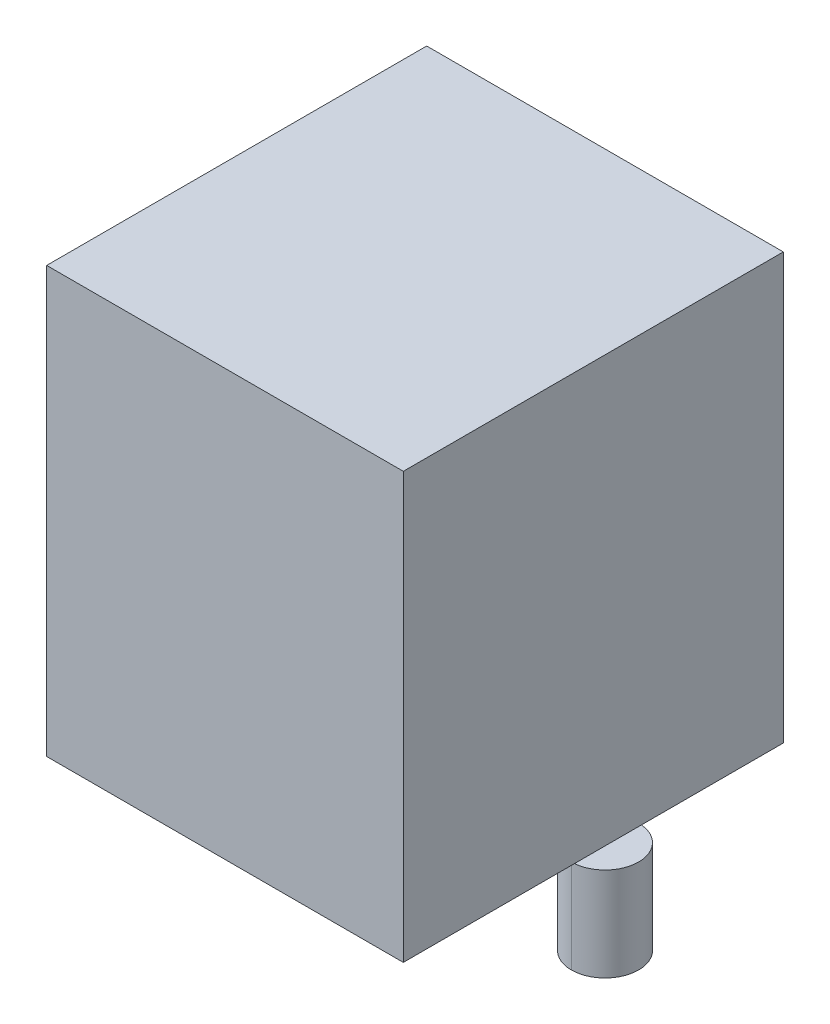
ISO-10303-21;
HEADER;
FILE_DESCRIPTION(('STEP AP214'),'2;1');
FILE_NAME('part.step','',(''),(''),'','','');
FILE_SCHEMA(('AUTOMOTIVE_DESIGN { 1 0 10303 214 1 1 1 1 }'));
ENDSEC;
DATA;
#1=APPLICATION_CONTEXT('core data for automotive mechanical design processes');
#2=APPLICATION_PROTOCOL_DEFINITION('international standard','automotive_design',2000,#1);
#3=PRODUCT_CONTEXT('',#1,'mechanical');
#4=PRODUCT('Part','Part','',(#3));
#5=PRODUCT_RELATED_PRODUCT_CATEGORY('part','',(#4));
#6=PRODUCT_DEFINITION_FORMATION('','',#4);
#7=PRODUCT_DEFINITION_CONTEXT('part definition',#1,'design');
#8=PRODUCT_DEFINITION('design','',#6,#7);
#9=PRODUCT_DEFINITION_SHAPE('','',#8);
#10=(LENGTH_UNIT() NAMED_UNIT(*) SI_UNIT(.MILLI.,.METRE.));
#11=(NAMED_UNIT(*) PLANE_ANGLE_UNIT() SI_UNIT($,.RADIAN.));
#12=(NAMED_UNIT(*) SI_UNIT($,.STERADIAN.) SOLID_ANGLE_UNIT());
#13=UNCERTAINTY_MEASURE_WITH_UNIT(LENGTH_MEASURE(1.E-05),#10,'distance_accuracy_value','');
#14=(GEOMETRIC_REPRESENTATION_CONTEXT(3) GLOBAL_UNCERTAINTY_ASSIGNED_CONTEXT((#13)) GLOBAL_UNIT_ASSIGNED_CONTEXT((#10,
#11,#12)) REPRESENTATION_CONTEXT('',''));
#15=CARTESIAN_POINT('',(0.,0.,0.));
#16=DIRECTION('',(0.,0.,1.));
#17=DIRECTION('',(1.,0.,0.));
#18=AXIS2_PLACEMENT_3D('',#15,#16,#17);
#19=CARTESIAN_POINT('',(0.,0.,-4.));
#20=DIRECTION('',(0.,0.,-1.));
#21=DIRECTION('',(0.,-1.,0.));
#22=AXIS2_PLACEMENT_3D('',#19,#20,#21);
#23=PLANE('',#22);
#24=DIRECTION('',(0.,-1.,0.));
#25=VECTOR('',#24,1.);
#26=CARTESIAN_POINT('',(4.938294179894,14.55,-4.));
#27=LINE('',#26,#25);
#28=CARTESIAN_POINT('',(4.938294179894,13.43753600184,-4.));
#29=VERTEX_POINT('',#28);
#30=CARTESIAN_POINT('',(4.938294179894,1.166122705314,-4.));
#31=VERTEX_POINT('',#30);
#32=EDGE_CURVE('E250',#29,#31,#27,.T.);
#33=ORIENTED_EDGE('',*,*,#32,.T.);
#34=DIRECTION('',(-1.,0.,0.));
#35=VECTOR('',#34,1.);
#36=CARTESIAN_POINT('',(0.,1.166122705314,-4.));
#37=LINE('',#36,#35);
#38=CARTESIAN_POINT('',(-4.938294179894,1.166122705314,-4.));
#39=VERTEX_POINT('',#38);
#40=EDGE_CURVE('E11',#31,#39,#37,.T.);
#41=ORIENTED_EDGE('',*,*,#40,.T.);
#42=DIRECTION('',(0.,1.,0.));
#43=VECTOR('',#42,1.);
#44=CARTESIAN_POINT('',(-4.938294179894,14.55,-4.));
#45=LINE('',#44,#43);
#46=CARTESIAN_POINT('',(-4.938294179894,13.43753600184,-4.));
#47=VERTEX_POINT('',#46);
#48=EDGE_CURVE('E225',#39,#47,#45,.T.);
#49=ORIENTED_EDGE('',*,*,#48,.T.);
#50=DIRECTION('',(1.,0.,0.));
#51=VECTOR('',#50,1.);
#52=CARTESIAN_POINT('',(0.,13.43753600184,-4.));
#53=LINE('',#52,#51);
#54=EDGE_CURVE('E231',#47,#29,#53,.T.);
#55=ORIENTED_EDGE('',*,*,#54,.T.);
#56=EDGE_LOOP('',(#33,#41,#49,#55));
#57=FACE_BOUND('',#56,.T.);
#58=ADVANCED_FACE('F16',(#57),#23,.T.);
#59=CARTESIAN_POINT('',(0.,1.166122705314,-4.));
#60=DIRECTION('',(0.,-1.,0.));
#61=DIRECTION('',(0.,0.,-1.));
#62=AXIS2_PLACEMENT_3D('',#59,#60,#61);
#63=PLANE('',#62);
#64=DIRECTION('',(-1.,0.,0.));
#65=VECTOR('',#64,1.);
#66=CARTESIAN_POINT('',(0.,1.166122705314,-6.));
#67=LINE('',#66,#65);
#68=CARTESIAN_POINT('',(4.938294179894,1.166122705314,-6.));
#69=VERTEX_POINT('',#68);
#70=CARTESIAN_POINT('',(-4.938294179894,1.166122705314,-6.));
#71=VERTEX_POINT('',#70);
#72=EDGE_CURVE('E20',#69,#71,#67,.T.);
#73=ORIENTED_EDGE('',*,*,#72,.T.);
#74=DIRECTION('',(0.,0.,-1.));
#75=VECTOR('',#74,1.);
#76=CARTESIAN_POINT('',(-4.938294179894,1.166122705314,-4.));
#77=LINE('',#76,#75);
#78=EDGE_CURVE('E27',#39,#71,#77,.T.);
#79=ORIENTED_EDGE('',*,*,#78,.F.);
#80=ORIENTED_EDGE('',*,*,#40,.F.);
#81=DIRECTION('',(0.,0.,-1.));
#82=VECTOR('',#81,1.);
#83=CARTESIAN_POINT('',(4.938294179894,1.166122705314,-4.));
#84=LINE('',#83,#82);
#85=EDGE_CURVE('E149',#31,#69,#84,.T.);
#86=ORIENTED_EDGE('',*,*,#85,.T.);
#87=EDGE_LOOP('',(#73,#79,#80,#86));
#88=FACE_BOUND('',#87,.T.);
#89=ADVANCED_FACE('F358',(#88),#63,.F.);
#90=CARTESIAN_POINT('',(-4.938294179894,14.55,-4.));
#91=DIRECTION('',(-1.,0.,0.));
#92=DIRECTION('',(0.,0.,1.));
#93=AXIS2_PLACEMENT_3D('',#90,#91,#92);
#94=PLANE('',#93);
#95=DIRECTION('',(0.,1.,0.));
#96=VECTOR('',#95,1.);
#97=CARTESIAN_POINT('',(-4.938294179894,14.55,-6.));
#98=LINE('',#97,#96);
#99=CARTESIAN_POINT('',(-4.938294179894,13.43753600184,-6.));
#100=VERTEX_POINT('',#99);
#101=EDGE_CURVE('E272',#71,#100,#98,.T.);
#102=ORIENTED_EDGE('',*,*,#101,.T.);
#103=DIRECTION('',(0.,0.,-1.));
#104=VECTOR('',#103,1.);
#105=CARTESIAN_POINT('',(-4.938294179894,13.43753600184,-4.));
#106=LINE('',#105,#104);
#107=EDGE_CURVE('E228',#47,#100,#106,.T.);
#108=ORIENTED_EDGE('',*,*,#107,.F.);
#109=ORIENTED_EDGE('',*,*,#48,.F.);
#110=ORIENTED_EDGE('',*,*,#78,.T.);
#111=EDGE_LOOP('',(#102,#108,#109,#110));
#112=FACE_BOUND('',#111,.T.);
#113=ADVANCED_FACE('F362',(#112),#94,.F.);
#114=CARTESIAN_POINT('',(0.,13.43753600184,-4.));
#115=DIRECTION('',(0.,1.,0.));
#116=DIRECTION('',(1.,0.,0.));
#117=AXIS2_PLACEMENT_3D('',#114,#115,#116);
#118=PLANE('',#117);
#119=DIRECTION('',(1.,0.,0.));
#120=VECTOR('',#119,1.);
#121=CARTESIAN_POINT('',(0.,13.43753600184,-6.));
#122=LINE('',#121,#120);
#123=CARTESIAN_POINT('',(4.938294179894,13.43753600184,-6.));
#124=VERTEX_POINT('',#123);
#125=EDGE_CURVE('E264',#100,#124,#122,.T.);
#126=ORIENTED_EDGE('',*,*,#125,.T.);
#127=DIRECTION('',(0.,0.,-1.));
#128=VECTOR('',#127,1.);
#129=CARTESIAN_POINT('',(4.938294179894,13.43753600184,-4.));
#130=LINE('',#129,#128);
#131=EDGE_CURVE('E234',#29,#124,#130,.T.);
#132=ORIENTED_EDGE('',*,*,#131,.F.);
#133=ORIENTED_EDGE('',*,*,#54,.F.);
#134=ORIENTED_EDGE('',*,*,#107,.T.);
#135=EDGE_LOOP('',(#126,#132,#133,#134));
#136=FACE_BOUND('',#135,.T.);
#137=ADVANCED_FACE('F374',(#136),#118,.F.);
#138=CARTESIAN_POINT('',(4.938294179894,14.55,-4.));
#139=DIRECTION('',(1.,0.,0.));
#140=DIRECTION('',(0.,1.,0.));
#141=AXIS2_PLACEMENT_3D('',#138,#139,#140);
#142=PLANE('',#141);
#143=DIRECTION('',(0.,-1.,0.));
#144=VECTOR('',#143,1.);
#145=CARTESIAN_POINT('',(4.938294179894,14.55,-6.));
#146=LINE('',#145,#144);
#147=EDGE_CURVE('E197',#124,#69,#146,.T.);
#148=ORIENTED_EDGE('',*,*,#147,.T.);
#149=ORIENTED_EDGE('',*,*,#85,.F.);
#150=ORIENTED_EDGE('',*,*,#32,.F.);
#151=ORIENTED_EDGE('',*,*,#131,.T.);
#152=EDGE_LOOP('',(#148,#149,#150,#151));
#153=FACE_BOUND('',#152,.T.);
#154=ADVANCED_FACE('F371',(#153),#142,.F.);
#155=CARTESIAN_POINT('',(0.,0.,0.));
#156=DIRECTION('',(0.,1.,0.));
#157=DIRECTION('',(1.,0.,0.));
#158=AXIS2_PLACEMENT_3D('',#155,#156,#157);
#159=PLANE('',#158);
#160=CARTESIAN_POINT('',(6.,0.,0.));
#161=DIRECTION('',(0.,1.,0.));
#162=DIRECTION('',(0.,0.,1.));
#163=AXIS2_PLACEMENT_3D('',#160,#161,#162);
#164=CIRCLE('',#163,1.15);
#165=CARTESIAN_POINT('',(6.1,0.,1.145643923739));
#166=VERTEX_POINT('',#165);
#167=CARTESIAN_POINT('',(6.1,0.,-1.145643923739));
#168=VERTEX_POINT('',#167);
#169=EDGE_CURVE('E183',#166,#168,#164,.T.);
#170=ORIENTED_EDGE('',*,*,#169,.T.);
#171=DIRECTION('',(0.,0.,1.));
#172=VECTOR('',#171,1.);
#173=CARTESIAN_POINT('',(6.1,0.,0.));
#174=LINE('',#173,#172);
#175=EDGE_CURVE('E150',#168,#166,#174,.T.);
#176=ORIENTED_EDGE('',*,*,#175,.T.);
#177=EDGE_LOOP('',(#170,#176));
#178=FACE_BOUND('',#177,.T.);
#179=ADVANCED_FACE('F318',(#178),#159,.T.);
#180=CARTESIAN_POINT('',(0.,-3.2,0.));
#181=DIRECTION('',(0.,1.,0.));
#182=DIRECTION('',(1.,0.,0.));
#183=AXIS2_PLACEMENT_3D('',#180,#181,#182);
#184=PLANE('',#183);
#185=CARTESIAN_POINT('',(6.,-3.2,0.));
#186=DIRECTION('',(0.,1.,0.));
#187=DIRECTION('',(0.,0.,1.));
#188=AXIS2_PLACEMENT_3D('',#185,#186,#187);
#189=CIRCLE('',#188,1.15);
#190=CARTESIAN_POINT('',(6.,-3.2,1.15));
#191=VERTEX_POINT('',#190);
#192=CARTESIAN_POINT('',(6.,-3.2,-1.15));
#193=VERTEX_POINT('',#192);
#194=EDGE_CURVE('E153',#191,#193,#189,.T.);
#195=ORIENTED_EDGE('',*,*,#194,.F.);
#196=CARTESIAN_POINT('',(6.,-3.2,0.));
#197=DIRECTION('',(0.,1.,0.));
#198=DIRECTION('',(0.,0.,1.));
#199=AXIS2_PLACEMENT_3D('',#196,#197,#198);
#200=CIRCLE('',#199,1.15);
#201=EDGE_CURVE('E138',#193,#191,#200,.T.);
#202=ORIENTED_EDGE('',*,*,#201,.F.);
#203=EDGE_LOOP('',(#195,#202));
#204=FACE_BOUND('',#203,.T.);
#205=ADVANCED_FACE('F160',(#204),#184,.F.);
#206=CARTESIAN_POINT('',(6.,-3.2,0.));
#207=DIRECTION('',(0.,1.,0.));
#208=DIRECTION('',(0.,0.,1.));
#209=AXIS2_PLACEMENT_3D('',#206,#207,#208);
#210=CYLINDRICAL_SURFACE('',#209,1.15);
#211=DIRECTION('',(0.,1.,0.));
#212=VECTOR('',#211,1.);
#213=CARTESIAN_POINT('',(6.,-3.2,-1.15));
#214=LINE('',#213,#212);
#215=CARTESIAN_POINT('',(6.,0.,-1.15));
#216=VERTEX_POINT('',#215);
#217=EDGE_CURVE('E144',#193,#216,#214,.T.);
#218=ORIENTED_EDGE('',*,*,#217,.F.);
#219=ORIENTED_EDGE('',*,*,#201,.T.);
#220=DIRECTION('',(0.,1.,0.));
#221=VECTOR('',#220,1.);
#222=CARTESIAN_POINT('',(6.,-3.2,1.15));
#223=LINE('',#222,#221);
#224=CARTESIAN_POINT('',(6.,0.,1.15));
#225=VERTEX_POINT('',#224);
#226=EDGE_CURVE('E141',#191,#225,#223,.T.);
#227=ORIENTED_EDGE('',*,*,#226,.T.);
#228=CARTESIAN_POINT('',(6.,0.,0.));
#229=DIRECTION('',(0.,1.,0.));
#230=DIRECTION('',(0.,0.,1.));
#231=AXIS2_PLACEMENT_3D('',#228,#229,#230);
#232=CIRCLE('',#231,1.15);
#233=EDGE_CURVE('E224',#216,#225,#232,.T.);
#234=ORIENTED_EDGE('',*,*,#233,.F.);
#235=EDGE_LOOP('',(#218,#219,#227,#234));
#236=FACE_BOUND('',#235,.T.);
#237=ADVANCED_FACE('F140',(#236),#210,.T.);
#238=CARTESIAN_POINT('',(0.,14.55,0.));
#239=DIRECTION('',(0.,1.,0.));
#240=DIRECTION('',(1.,0.,0.));
#241=AXIS2_PLACEMENT_3D('',#238,#239,#240);
#242=PLANE('',#241);
#243=DIRECTION('',(1.,0.,0.));
#244=VECTOR('',#243,1.);
#245=CARTESIAN_POINT('',(0.,14.55,-6.));
#246=LINE('',#245,#244);
#247=CARTESIAN_POINT('',(-6.1,14.55,-6.));
#248=VERTEX_POINT('',#247);
#249=CARTESIAN_POINT('',(6.1,14.55,-6.));
#250=VERTEX_POINT('',#249);
#251=EDGE_CURVE('E212',#248,#250,#246,.T.);
#252=ORIENTED_EDGE('',*,*,#251,.F.);
#253=DIRECTION('',(0.,0.,1.));
#254=VECTOR('',#253,1.);
#255=CARTESIAN_POINT('',(-6.1,14.55,0.));
#256=LINE('',#255,#254);
#257=CARTESIAN_POINT('',(-6.1,14.55,7.));
#258=VERTEX_POINT('',#257);
#259=EDGE_CURVE('E198',#248,#258,#256,.T.);
#260=ORIENTED_EDGE('',*,*,#259,.T.);
#261=DIRECTION('',(1.,0.,0.));
#262=VECTOR('',#261,1.);
#263=CARTESIAN_POINT('',(0.,14.55,7.));
#264=LINE('',#263,#262);
#265=CARTESIAN_POINT('',(6.1,14.55,7.));
#266=VERTEX_POINT('',#265);
#267=EDGE_CURVE('E206',#258,#266,#264,.T.);
#268=ORIENTED_EDGE('',*,*,#267,.T.);
#269=DIRECTION('',(0.,0.,1.));
#270=VECTOR('',#269,1.);
#271=CARTESIAN_POINT('',(6.1,14.55,0.));
#272=LINE('',#271,#270);
#273=EDGE_CURVE('E204',#250,#266,#272,.T.);
#274=ORIENTED_EDGE('',*,*,#273,.F.);
#275=EDGE_LOOP('',(#252,#260,#268,#274));
#276=FACE_BOUND('',#275,.T.);
#277=ADVANCED_FACE('F373',(#276),#242,.T.);
#278=CARTESIAN_POINT('',(6.1,14.55,0.));
#279=DIRECTION('',(1.,0.,0.));
#280=DIRECTION('',(0.,0.,-1.));
#281=AXIS2_PLACEMENT_3D('',#278,#279,#280);
#282=PLANE('',#281);
#283=DIRECTION('',(0.,0.,1.));
#284=VECTOR('',#283,1.);
#285=CARTESIAN_POINT('',(6.1,0.,0.));
#286=LINE('',#285,#284);
#287=CARTESIAN_POINT('',(6.1,0.,-6.));
#288=VERTEX_POINT('',#287);
#289=EDGE_CURVE('E182',#288,#168,#286,.T.);
#290=ORIENTED_EDGE('',*,*,#289,.F.);
#291=DIRECTION('',(0.,-1.,0.));
#292=VECTOR('',#291,1.);
#293=CARTESIAN_POINT('',(6.1,14.55,-6.));
#294=LINE('',#293,#292);
#295=EDGE_CURVE('E211',#250,#288,#294,.T.);
#296=ORIENTED_EDGE('',*,*,#295,.F.);
#297=ORIENTED_EDGE('',*,*,#273,.T.);
#298=DIRECTION('',(0.,-1.,0.));
#299=VECTOR('',#298,1.);
#300=CARTESIAN_POINT('',(6.1,14.55,7.));
#301=LINE('',#300,#299);
#302=CARTESIAN_POINT('',(6.1,0.,7.));
#303=VERTEX_POINT('',#302);
#304=EDGE_CURVE('E202',#266,#303,#301,.T.);
#305=ORIENTED_EDGE('',*,*,#304,.T.);
#306=DIRECTION('',(0.,0.,1.));
#307=VECTOR('',#306,1.);
#308=CARTESIAN_POINT('',(6.1,0.,0.));
#309=LINE('',#308,#307);
#310=EDGE_CURVE('E220',#166,#303,#309,.T.);
#311=ORIENTED_EDGE('',*,*,#310,.F.);
#312=ORIENTED_EDGE('',*,*,#175,.F.);
#313=EDGE_LOOP('',(#290,#296,#297,#305,#311,#312));
#314=FACE_BOUND('',#313,.T.);
#315=ADVANCED_FACE('F321',(#314),#282,.T.);
#316=CARTESIAN_POINT('',(0.,14.55,7.));
#317=DIRECTION('',(0.,0.,-1.));
#318=DIRECTION('',(0.,-1.,0.));
#319=AXIS2_PLACEMENT_3D('',#316,#317,#318);
#320=PLANE('',#319);
#321=DIRECTION('',(1.,0.,0.));
#322=VECTOR('',#321,1.);
#323=CARTESIAN_POINT('',(0.,0.,7.));
#324=LINE('',#323,#322);
#325=CARTESIAN_POINT('',(-6.1,0.,7.));
#326=VERTEX_POINT('',#325);
#327=EDGE_CURVE('E192',#326,#303,#324,.T.);
#328=ORIENTED_EDGE('',*,*,#327,.T.);
#329=ORIENTED_EDGE('',*,*,#304,.F.);
#330=ORIENTED_EDGE('',*,*,#267,.F.);
#331=DIRECTION('',(0.,-1.,0.));
#332=VECTOR('',#331,1.);
#333=CARTESIAN_POINT('',(-6.1,14.55,7.));
#334=LINE('',#333,#332);
#335=EDGE_CURVE('E203',#258,#326,#334,.T.);
#336=ORIENTED_EDGE('',*,*,#335,.T.);
#337=EDGE_LOOP('',(#328,#329,#330,#336));
#338=FACE_BOUND('',#337,.T.);
#339=ADVANCED_FACE('F326',(#338),#320,.F.);
#340=CARTESIAN_POINT('',(-6.1,14.55,0.));
#341=DIRECTION('',(1.,0.,0.));
#342=DIRECTION('',(0.,0.,1.));
#343=AXIS2_PLACEMENT_3D('',#340,#341,#342);
#344=PLANE('',#343);
#345=DIRECTION('',(0.,0.,1.));
#346=VECTOR('',#345,1.);
#347=CARTESIAN_POINT('',(-6.1,0.,0.));
#348=LINE('',#347,#346);
#349=CARTESIAN_POINT('',(-6.1,0.,-6.));
#350=VERTEX_POINT('',#349);
#351=CARTESIAN_POINT('',(-6.1,0.,-1.145643923739));
#352=VERTEX_POINT('',#351);
#353=EDGE_CURVE('E191',#350,#352,#348,.T.);
#354=ORIENTED_EDGE('',*,*,#353,.T.);
#355=DIRECTION('',(0.,0.,1.));
#356=VECTOR('',#355,1.);
#357=CARTESIAN_POINT('',(-6.1,0.,0.));
#358=LINE('',#357,#356);
#359=CARTESIAN_POINT('',(-6.1,0.,1.145643923739));
#360=VERTEX_POINT('',#359);
#361=EDGE_CURVE('E178',#352,#360,#358,.T.);
#362=ORIENTED_EDGE('',*,*,#361,.T.);
#363=DIRECTION('',(0.,0.,1.));
#364=VECTOR('',#363,1.);
#365=CARTESIAN_POINT('',(-6.1,0.,0.));
#366=LINE('',#365,#364);
#367=EDGE_CURVE('E187',#360,#326,#366,.T.);
#368=ORIENTED_EDGE('',*,*,#367,.T.);
#369=ORIENTED_EDGE('',*,*,#335,.F.);
#370=ORIENTED_EDGE('',*,*,#259,.F.);
#371=DIRECTION('',(0.,-1.,0.));
#372=VECTOR('',#371,1.);
#373=CARTESIAN_POINT('',(-6.1,14.55,-6.));
#374=LINE('',#373,#372);
#375=EDGE_CURVE('E216',#248,#350,#374,.T.);
#376=ORIENTED_EDGE('',*,*,#375,.T.);
#377=EDGE_LOOP('',(#354,#362,#368,#369,#370,#376));
#378=FACE_BOUND('',#377,.T.);
#379=ADVANCED_FACE('F328',(#378),#344,.F.);
#380=CARTESIAN_POINT('',(0.,14.55,-6.));
#381=DIRECTION('',(0.,0.,-1.));
#382=DIRECTION('',(0.,-1.,0.));
#383=AXIS2_PLACEMENT_3D('',#380,#381,#382);
#384=PLANE('',#383);
#385=DIRECTION('',(1.,0.,0.));
#386=VECTOR('',#385,1.);
#387=CARTESIAN_POINT('',(0.,0.,-6.));
#388=LINE('',#387,#386);
#389=EDGE_CURVE('E193',#350,#288,#388,.T.);
#390=ORIENTED_EDGE('',*,*,#389,.F.);
#391=ORIENTED_EDGE('',*,*,#375,.F.);
#392=ORIENTED_EDGE('',*,*,#251,.T.);
#393=ORIENTED_EDGE('',*,*,#295,.T.);
#394=EDGE_LOOP('',(#390,#391,#392,#393));
#395=FACE_BOUND('',#394,.T.);
#396=ORIENTED_EDGE('',*,*,#147,.F.);
#397=ORIENTED_EDGE('',*,*,#125,.F.);
#398=ORIENTED_EDGE('',*,*,#101,.F.);
#399=ORIENTED_EDGE('',*,*,#72,.F.);
#400=EDGE_LOOP('',(#396,#397,#398,#399));
#401=FACE_BOUND('',#400,.T.);
#402=ADVANCED_FACE('F391',(#395,#401),#384,.T.);
#403=CARTESIAN_POINT('',(0.,0.,0.));
#404=DIRECTION('',(0.,1.,0.));
#405=DIRECTION('',(1.,0.,0.));
#406=AXIS2_PLACEMENT_3D('',#403,#404,#405);
#407=PLANE('',#406);
#408=ORIENTED_EDGE('',*,*,#289,.T.);
#409=CARTESIAN_POINT('',(6.,0.,0.));
#410=DIRECTION('',(0.,1.,0.));
#411=DIRECTION('',(0.,0.,1.));
#412=AXIS2_PLACEMENT_3D('',#409,#410,#411);
#413=CIRCLE('',#412,1.15);
#414=EDGE_CURVE('E167',#168,#216,#413,.T.);
#415=ORIENTED_EDGE('',*,*,#414,.T.);
#416=ORIENTED_EDGE('',*,*,#233,.T.);
#417=CARTESIAN_POINT('',(6.,0.,0.));
#418=DIRECTION('',(0.,1.,0.));
#419=DIRECTION('',(0.,0.,1.));
#420=AXIS2_PLACEMENT_3D('',#417,#418,#419);
#421=CIRCLE('',#420,1.15);
#422=EDGE_CURVE('E156',#225,#166,#421,.T.);
#423=ORIENTED_EDGE('',*,*,#422,.T.);
#424=ORIENTED_EDGE('',*,*,#310,.T.);
#425=ORIENTED_EDGE('',*,*,#327,.F.);
#426=ORIENTED_EDGE('',*,*,#367,.F.);
#427=CARTESIAN_POINT('',(-6.,0.,0.));
#428=DIRECTION('',(0.,1.,0.));
#429=DIRECTION('',(0.,0.,1.));
#430=AXIS2_PLACEMENT_3D('',#427,#428,#429);
#431=CIRCLE('',#430,1.15);
#432=CARTESIAN_POINT('',(-6.,0.,1.15));
#433=VERTEX_POINT('',#432);
#434=EDGE_CURVE('E177',#360,#433,#431,.T.);
#435=ORIENTED_EDGE('',*,*,#434,.T.);
#436=CARTESIAN_POINT('',(-6.,0.,0.));
#437=DIRECTION('',(0.,1.,0.));
#438=DIRECTION('',(0.,0.,1.));
#439=AXIS2_PLACEMENT_3D('',#436,#437,#438);
#440=CIRCLE('',#439,1.15);
#441=CARTESIAN_POINT('',(-6.,0.,-1.15));
#442=VERTEX_POINT('',#441);
#443=EDGE_CURVE('E269',#433,#442,#440,.T.);
#444=ORIENTED_EDGE('',*,*,#443,.T.);
#445=CARTESIAN_POINT('',(-6.,0.,0.));
#446=DIRECTION('',(0.,1.,0.));
#447=DIRECTION('',(0.,0.,1.));
#448=AXIS2_PLACEMENT_3D('',#445,#446,#447);
#449=CIRCLE('',#448,1.15);
#450=EDGE_CURVE('E176',#442,#352,#449,.T.);
#451=ORIENTED_EDGE('',*,*,#450,.T.);
#452=ORIENTED_EDGE('',*,*,#353,.F.);
#453=ORIENTED_EDGE('',*,*,#389,.T.);
#454=EDGE_LOOP('',(#408,#415,#416,#423,#424,#425,#426,#435,#444,#451,#452,#453));
#455=FACE_BOUND('',#454,.T.);
#456=ADVANCED_FACE('F315',(#455),#407,.F.);
#457=CARTESIAN_POINT('',(0.,0.,0.));
#458=DIRECTION('',(0.,1.,0.));
#459=DIRECTION('',(1.,0.,0.));
#460=AXIS2_PLACEMENT_3D('',#457,#458,#459);
#461=PLANE('',#460);
#462=ORIENTED_EDGE('',*,*,#361,.F.);
#463=CARTESIAN_POINT('',(-6.,0.,0.));
#464=DIRECTION('',(0.,1.,0.));
#465=DIRECTION('',(0.,0.,1.));
#466=AXIS2_PLACEMENT_3D('',#463,#464,#465);
#467=CIRCLE('',#466,1.15);
#468=EDGE_CURVE('E173',#352,#360,#467,.T.);
#469=ORIENTED_EDGE('',*,*,#468,.T.);
#470=EDGE_LOOP('',(#462,#469));
#471=FACE_BOUND('',#470,.T.);
#472=ADVANCED_FACE('F334',(#471),#461,.T.);
#473=CARTESIAN_POINT('',(0.,-3.2,0.));
#474=DIRECTION('',(0.,1.,0.));
#475=DIRECTION('',(1.,0.,0.));
#476=AXIS2_PLACEMENT_3D('',#473,#474,#475);
#477=PLANE('',#476);
#478=CARTESIAN_POINT('',(-6.,-3.2,0.));
#479=DIRECTION('',(0.,1.,0.));
#480=DIRECTION('',(0.,0.,1.));
#481=AXIS2_PLACEMENT_3D('',#478,#479,#480);
#482=CIRCLE('',#481,1.15);
#483=CARTESIAN_POINT('',(-6.,-3.2,1.15));
#484=VERTEX_POINT('',#483);
#485=CARTESIAN_POINT('',(-6.,-3.2,-1.15));
#486=VERTEX_POINT('',#485);
#487=EDGE_CURVE('E158',#484,#486,#482,.T.);
#488=ORIENTED_EDGE('',*,*,#487,.F.);
#489=CARTESIAN_POINT('',(-6.,-3.2,0.));
#490=DIRECTION('',(0.,1.,0.));
#491=DIRECTION('',(0.,0.,1.));
#492=AXIS2_PLACEMENT_3D('',#489,#490,#491);
#493=CIRCLE('',#492,1.15);
#494=EDGE_CURVE('E246',#486,#484,#493,.T.);
#495=ORIENTED_EDGE('',*,*,#494,.F.);
#496=EDGE_LOOP('',(#488,#495));
#497=FACE_BOUND('',#496,.T.);
#498=ADVANCED_FACE('F345',(#497),#477,.F.);
#499=CARTESIAN_POINT('',(-6.,-3.2,0.));
#500=DIRECTION('',(0.,1.,0.));
#501=DIRECTION('',(0.,0.,1.));
#502=AXIS2_PLACEMENT_3D('',#499,#500,#501);
#503=CYLINDRICAL_SURFACE('',#502,1.15);
#504=DIRECTION('',(0.,1.,0.));
#505=VECTOR('',#504,1.);
#506=CARTESIAN_POINT('',(-6.,-3.2,-1.15));
#507=LINE('',#506,#505);
#508=EDGE_CURVE('E265',#486,#442,#507,.T.);
#509=ORIENTED_EDGE('',*,*,#508,.F.);
#510=ORIENTED_EDGE('',*,*,#494,.T.);
#511=DIRECTION('',(0.,1.,0.));
#512=VECTOR('',#511,1.);
#513=CARTESIAN_POINT('',(-6.,-3.2,1.15));
#514=LINE('',#513,#512);
#515=EDGE_CURVE('E171',#484,#433,#514,.T.);
#516=ORIENTED_EDGE('',*,*,#515,.T.);
#517=ORIENTED_EDGE('',*,*,#434,.F.);
#518=ORIENTED_EDGE('',*,*,#468,.F.);
#519=ORIENTED_EDGE('',*,*,#450,.F.);
#520=EDGE_LOOP('',(#509,#510,#516,#517,#518,#519));
#521=FACE_BOUND('',#520,.T.);
#522=ADVANCED_FACE('F338',(#521),#503,.T.);
#523=CARTESIAN_POINT('',(-6.,-3.2,0.));
#524=DIRECTION('',(0.,1.,0.));
#525=DIRECTION('',(0.,0.,1.));
#526=AXIS2_PLACEMENT_3D('',#523,#524,#525);
#527=CYLINDRICAL_SURFACE('',#526,1.15);
#528=ORIENTED_EDGE('',*,*,#487,.T.);
#529=ORIENTED_EDGE('',*,*,#508,.T.);
#530=ORIENTED_EDGE('',*,*,#443,.F.);
#531=ORIENTED_EDGE('',*,*,#515,.F.);
#532=EDGE_LOOP('',(#528,#529,#530,#531));
#533=FACE_BOUND('',#532,.T.);
#534=ADVANCED_FACE('F342',(#533),#527,.T.);
#535=CARTESIAN_POINT('',(6.,-3.2,0.));
#536=DIRECTION('',(0.,1.,0.));
#537=DIRECTION('',(0.,0.,1.));
#538=AXIS2_PLACEMENT_3D('',#535,#536,#537);
#539=CYLINDRICAL_SURFACE('',#538,1.15);
#540=ORIENTED_EDGE('',*,*,#194,.T.);
#541=ORIENTED_EDGE('',*,*,#217,.T.);
#542=ORIENTED_EDGE('',*,*,#414,.F.);
#543=ORIENTED_EDGE('',*,*,#169,.F.);
#544=ORIENTED_EDGE('',*,*,#422,.F.);
#545=ORIENTED_EDGE('',*,*,#226,.F.);
#546=EDGE_LOOP('',(#540,#541,#542,#543,#544,#545));
#547=FACE_BOUND('',#546,.T.);
#548=ADVANCED_FACE('F18',(#547),#539,.T.);
#549=CLOSED_SHELL('',(#58,#89,#113,#137,#154,#179,#205,#237,#277,#315,#339,#379,#402,#456,#472,
#498,#522,#534,#548));
#550=MANIFOLD_SOLID_BREP('B1',#549);
#551=ADVANCED_BREP_SHAPE_REPRESENTATION('',(#18,#550),#14);
#552=SHAPE_DEFINITION_REPRESENTATION(#9,#551);
ENDSEC;
END-ISO-10303-21;
